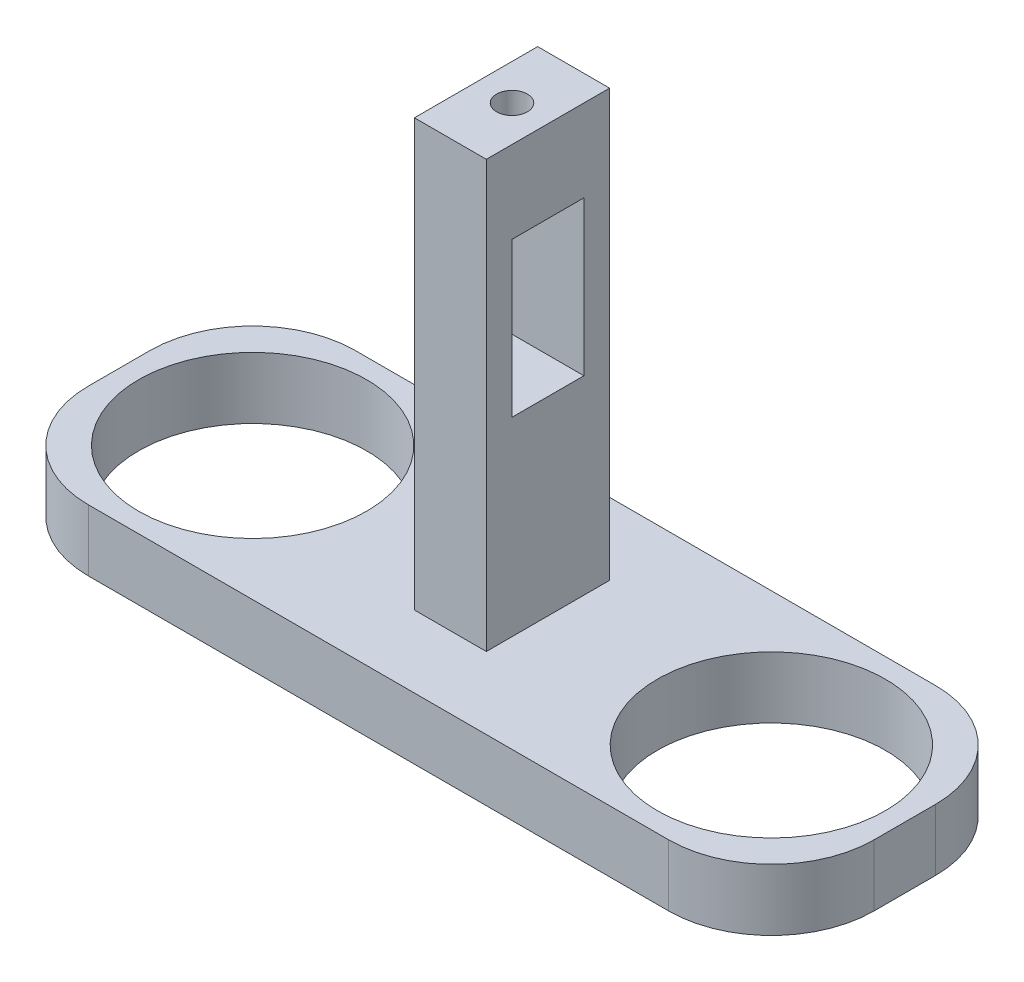
ISO-10303-21;
HEADER;
FILE_DESCRIPTION(('STEP AP214'),'2;1');
FILE_NAME('part.step','',(''),(''),'','','');
FILE_SCHEMA(('AUTOMOTIVE_DESIGN { 1 0 10303 214 1 1 1 1 }'));
ENDSEC;
DATA;
#1=APPLICATION_CONTEXT('core data for automotive mechanical design processes');
#2=APPLICATION_PROTOCOL_DEFINITION('international standard','automotive_design',2000,#1);
#3=PRODUCT_CONTEXT('',#1,'mechanical');
#4=PRODUCT('Part','Part','',(#3));
#5=PRODUCT_RELATED_PRODUCT_CATEGORY('part','',(#4));
#6=PRODUCT_DEFINITION_FORMATION('','',#4);
#7=PRODUCT_DEFINITION_CONTEXT('part definition',#1,'design');
#8=PRODUCT_DEFINITION('design','',#6,#7);
#9=PRODUCT_DEFINITION_SHAPE('','',#8);
#10=(LENGTH_UNIT() NAMED_UNIT(*) SI_UNIT(.MILLI.,.METRE.));
#11=(NAMED_UNIT(*) PLANE_ANGLE_UNIT() SI_UNIT($,.RADIAN.));
#12=(NAMED_UNIT(*) SI_UNIT($,.STERADIAN.) SOLID_ANGLE_UNIT());
#13=UNCERTAINTY_MEASURE_WITH_UNIT(LENGTH_MEASURE(1.E-05),#10,'distance_accuracy_value','');
#14=(GEOMETRIC_REPRESENTATION_CONTEXT(3) GLOBAL_UNCERTAINTY_ASSIGNED_CONTEXT((#13)) GLOBAL_UNIT_ASSIGNED_CONTEXT((#10,
#11,#12)) REPRESENTATION_CONTEXT('',''));
#15=CARTESIAN_POINT('',(0.,0.,0.));
#16=DIRECTION('',(0.,0.,1.));
#17=DIRECTION('',(1.,0.,0.));
#18=AXIS2_PLACEMENT_3D('',#15,#16,#17);
#19=CARTESIAN_POINT('',(-20.875,6.,13.));
#20=DIRECTION('',(1.,0.,0.));
#21=DIRECTION('',(0.,0.,-1.));
#22=AXIS2_PLACEMENT_3D('',#19,#20,#21);
#23=PLANE('',#22);
#24=DIRECTION('',(0.,0.,-1.));
#25=VECTOR('',#24,1.);
#26=CARTESIAN_POINT('',(-20.875,6.,13.));
#27=LINE('',#26,#25);
#28=CARTESIAN_POINT('',(-20.875,6.,6.));
#29=VERTEX_POINT('',#28);
#30=CARTESIAN_POINT('',(-20.875,6.,-6.));
#31=VERTEX_POINT('',#30);
#32=EDGE_CURVE('E204',#29,#31,#27,.T.);
#33=ORIENTED_EDGE('',*,*,#32,.F.);
#34=DIRECTION('',(0.,-1.,0.));
#35=VECTOR('',#34,1.);
#36=CARTESIAN_POINT('',(-20.875,47.5,6.));
#37=LINE('',#36,#35);
#38=CARTESIAN_POINT('',(-20.875,47.5,6.));
#39=VERTEX_POINT('',#38);
#40=EDGE_CURVE('E232',#39,#29,#37,.T.);
#41=ORIENTED_EDGE('',*,*,#40,.F.);
#42=DIRECTION('',(0.,0.,-1.));
#43=VECTOR('',#42,1.);
#44=CARTESIAN_POINT('',(-20.875,47.5,6.));
#45=LINE('',#44,#43);
#46=CARTESIAN_POINT('',(-20.875,47.5,-6.));
#47=VERTEX_POINT('',#46);
#48=EDGE_CURVE('E212',#39,#47,#45,.T.);
#49=ORIENTED_EDGE('',*,*,#48,.T.);
#50=DIRECTION('',(0.,-1.,0.));
#51=VECTOR('',#50,1.);
#52=CARTESIAN_POINT('',(-20.875,47.5,-6.));
#53=LINE('',#52,#51);
#54=EDGE_CURVE('E235',#47,#31,#53,.T.);
#55=ORIENTED_EDGE('',*,*,#54,.T.);
#56=EDGE_LOOP('',(#33,#41,#49,#55));
#57=FACE_BOUND('',#56,.T.);
#58=DIRECTION('',(0.,1.,0.));
#59=VECTOR('',#58,1.);
#60=CARTESIAN_POINT('',(-20.875,39.5,3.5));
#61=LINE('',#60,#59);
#62=CARTESIAN_POINT('',(-20.875,24.5,3.5));
#63=VERTEX_POINT('',#62);
#64=CARTESIAN_POINT('',(-20.875,39.5,3.5));
#65=VERTEX_POINT('',#64);
#66=EDGE_CURVE('E161',#63,#65,#61,.T.);
#67=ORIENTED_EDGE('',*,*,#66,.F.);
#68=DIRECTION('',(0.,0.,1.));
#69=VECTOR('',#68,1.);
#70=CARTESIAN_POINT('',(-20.875,24.5,-3.5));
#71=LINE('',#70,#69);
#72=CARTESIAN_POINT('',(-20.875,24.5,-3.5));
#73=VERTEX_POINT('',#72);
#74=EDGE_CURVE('E149',#73,#63,#71,.T.);
#75=ORIENTED_EDGE('',*,*,#74,.F.);
#76=DIRECTION('',(0.,-1.,0.));
#77=VECTOR('',#76,1.);
#78=CARTESIAN_POINT('',(-20.875,39.5,-3.5));
#79=LINE('',#78,#77);
#80=CARTESIAN_POINT('',(-20.875,39.5,-3.5));
#81=VERTEX_POINT('',#80);
#82=EDGE_CURVE('E160',#81,#73,#79,.T.);
#83=ORIENTED_EDGE('',*,*,#82,.F.);
#84=DIRECTION('',(0.,0.,-1.));
#85=VECTOR('',#84,1.);
#86=CARTESIAN_POINT('',(-20.875,39.5,-3.5));
#87=LINE('',#86,#85);
#88=EDGE_CURVE('E169',#65,#81,#87,.T.);
#89=ORIENTED_EDGE('',*,*,#88,.F.);
#90=EDGE_LOOP('',(#67,#75,#83,#89));
#91=FACE_BOUND('',#90,.T.);
#92=ADVANCED_FACE('F33',(#57,#91),#23,.F.);
#93=CARTESIAN_POINT('',(-13.875,47.5,6.));
#94=DIRECTION('',(-1.,0.,0.));
#95=DIRECTION('',(0.,0.,1.));
#96=AXIS2_PLACEMENT_3D('',#93,#94,#95);
#97=PLANE('',#96);
#98=DIRECTION('',(0.,0.,-1.));
#99=VECTOR('',#98,1.);
#100=CARTESIAN_POINT('',(-13.875,6.,6.));
#101=LINE('',#100,#99);
#102=CARTESIAN_POINT('',(-13.875,6.,6.));
#103=VERTEX_POINT('',#102);
#104=CARTESIAN_POINT('',(-13.875,6.,-6.));
#105=VERTEX_POINT('',#104);
#106=EDGE_CURVE('E213',#103,#105,#101,.T.);
#107=ORIENTED_EDGE('',*,*,#106,.T.);
#108=DIRECTION('',(0.,-1.,0.));
#109=VECTOR('',#108,1.);
#110=CARTESIAN_POINT('',(-13.875,47.5,-6.));
#111=LINE('',#110,#109);
#112=CARTESIAN_POINT('',(-13.875,47.5,-6.));
#113=VERTEX_POINT('',#112);
#114=EDGE_CURVE('E221',#113,#105,#111,.T.);
#115=ORIENTED_EDGE('',*,*,#114,.F.);
#116=DIRECTION('',(0.,0.,-1.));
#117=VECTOR('',#116,1.);
#118=CARTESIAN_POINT('',(-13.875,47.5,6.));
#119=LINE('',#118,#117);
#120=CARTESIAN_POINT('',(-13.875,47.5,6.));
#121=VERTEX_POINT('',#120);
#122=EDGE_CURVE('E219',#121,#113,#119,.T.);
#123=ORIENTED_EDGE('',*,*,#122,.F.);
#124=DIRECTION('',(0.,-1.,0.));
#125=VECTOR('',#124,1.);
#126=CARTESIAN_POINT('',(-13.875,47.5,6.));
#127=LINE('',#126,#125);
#128=EDGE_CURVE('E230',#121,#103,#127,.T.);
#129=ORIENTED_EDGE('',*,*,#128,.T.);
#130=EDGE_LOOP('',(#107,#115,#123,#129));
#131=FACE_BOUND('',#130,.T.);
#132=DIRECTION('',(0.,1.,0.));
#133=VECTOR('',#132,1.);
#134=CARTESIAN_POINT('',(-13.875,39.5,3.5));
#135=LINE('',#134,#133);
#136=CARTESIAN_POINT('',(-13.875,24.5,3.5));
#137=VERTEX_POINT('',#136);
#138=CARTESIAN_POINT('',(-13.875,39.5,3.5));
#139=VERTEX_POINT('',#138);
#140=EDGE_CURVE('E168',#137,#139,#135,.T.);
#141=ORIENTED_EDGE('',*,*,#140,.T.);
#142=DIRECTION('',(0.,0.,-1.));
#143=VECTOR('',#142,1.);
#144=CARTESIAN_POINT('',(-13.875,39.5,-3.5));
#145=LINE('',#144,#143);
#146=CARTESIAN_POINT('',(-13.875,39.5,-3.5));
#147=VERTEX_POINT('',#146);
#148=EDGE_CURVE('E172',#139,#147,#145,.T.);
#149=ORIENTED_EDGE('',*,*,#148,.T.);
#150=DIRECTION('',(0.,-1.,0.));
#151=VECTOR('',#150,1.);
#152=CARTESIAN_POINT('',(-13.875,39.5,-3.5));
#153=LINE('',#152,#151);
#154=CARTESIAN_POINT('',(-13.875,24.5,-3.5));
#155=VERTEX_POINT('',#154);
#156=EDGE_CURVE('E175',#147,#155,#153,.T.);
#157=ORIENTED_EDGE('',*,*,#156,.T.);
#158=DIRECTION('',(0.,0.,1.));
#159=VECTOR('',#158,1.);
#160=CARTESIAN_POINT('',(-13.875,24.5,-3.5));
#161=LINE('',#160,#159);
#162=EDGE_CURVE('E184',#155,#137,#161,.T.);
#163=ORIENTED_EDGE('',*,*,#162,.T.);
#164=EDGE_LOOP('',(#141,#149,#157,#163));
#165=FACE_BOUND('',#164,.T.);
#166=ADVANCED_FACE('F329',(#131,#165),#97,.F.);
#167=CARTESIAN_POINT('',(0.,6.,0.));
#168=DIRECTION('',(0.,-1.,0.));
#169=DIRECTION('',(0.,0.,-1.));
#170=AXIS2_PLACEMENT_3D('',#167,#168,#169);
#171=PLANE('',#170);
#172=CARTESIAN_POINT('',(-42.625,6.,0.));
#173=DIRECTION('',(0.,-1.,0.));
#174=DIRECTION('',(0.,0.,1.));
#175=AXIS2_PLACEMENT_3D('',#172,#173,#174);
#176=CIRCLE('',#175,11.1);
#177=CARTESIAN_POINT('',(-42.625,6.,11.1));
#178=VERTEX_POINT('',#177);
#179=EDGE_CURVE('E191',#178,#178,#176,.T.);
#180=ORIENTED_EDGE('',*,*,#179,.T.);
#181=EDGE_LOOP('',(#180));
#182=FACE_BOUND('',#181,.T.);
#183=DIRECTION('',(-1.,0.,0.));
#184=VECTOR('',#183,1.);
#185=CARTESIAN_POINT('',(-13.875,6.,-6.));
#186=LINE('',#185,#184);
#187=EDGE_CURVE('E209',#105,#31,#186,.T.);
#188=ORIENTED_EDGE('',*,*,#187,.F.);
#189=ORIENTED_EDGE('',*,*,#106,.F.);
#190=DIRECTION('',(-1.,0.,0.));
#191=VECTOR('',#190,1.);
#192=CARTESIAN_POINT('',(-13.875,6.,6.));
#193=LINE('',#192,#191);
#194=EDGE_CURVE('E224',#103,#29,#193,.T.);
#195=ORIENTED_EDGE('',*,*,#194,.T.);
#196=ORIENTED_EDGE('',*,*,#32,.T.);
#197=EDGE_LOOP('',(#188,#189,#195,#196));
#198=FACE_BOUND('',#197,.T.);
#199=CARTESIAN_POINT('',(7.875,6.,0.));
#200=DIRECTION('',(0.,1.,0.));
#201=DIRECTION('',(0.,0.,1.));
#202=AXIS2_PLACEMENT_3D('',#199,#200,#201);
#203=CIRCLE('',#202,11.1);
#204=CARTESIAN_POINT('',(7.875,6.,11.1));
#205=VERTEX_POINT('',#204);
#206=EDGE_CURVE('E237',#205,#205,#203,.T.);
#207=ORIENTED_EDGE('',*,*,#206,.F.);
#208=EDGE_LOOP('',(#207));
#209=FACE_BOUND('',#208,.T.);
#210=DIRECTION('',(-1.,0.,0.));
#211=VECTOR('',#210,1.);
#212=CARTESIAN_POINT('',(-20.875,6.,-13.));
#213=LINE('',#212,#211);
#214=CARTESIAN_POINT('',(10.875,6.,-13.));
#215=VERTEX_POINT('',#214);
#216=CARTESIAN_POINT('',(-45.625,6.,-13.));
#217=VERTEX_POINT('',#216);
#218=EDGE_CURVE('E247',#215,#217,#213,.T.);
#219=ORIENTED_EDGE('',*,*,#218,.T.);
#220=CARTESIAN_POINT('',(-45.625,6.,-3.));
#221=DIRECTION('',(0.,-1.,0.));
#222=DIRECTION('',(0.,0.,-1.));
#223=AXIS2_PLACEMENT_3D('',#220,#221,#222);
#224=CIRCLE('',#223,10.);
#225=CARTESIAN_POINT('',(-55.625,6.,-3.));
#226=VERTEX_POINT('',#225);
#227=EDGE_CURVE('E41',#217,#226,#224,.F.);
#228=ORIENTED_EDGE('',*,*,#227,.T.);
#229=DIRECTION('',(0.,0.,-1.));
#230=VECTOR('',#229,1.);
#231=CARTESIAN_POINT('',(-55.625,6.,13.));
#232=LINE('',#231,#230);
#233=CARTESIAN_POINT('',(-55.625,6.,3.));
#234=VERTEX_POINT('',#233);
#235=EDGE_CURVE('E201',#234,#226,#232,.T.);
#236=ORIENTED_EDGE('',*,*,#235,.F.);
#237=CARTESIAN_POINT('',(-45.625,6.,3.));
#238=DIRECTION('',(0.,-1.,0.));
#239=DIRECTION('',(0.,0.,-1.));
#240=AXIS2_PLACEMENT_3D('',#237,#238,#239);
#241=CIRCLE('',#240,10.);
#242=CARTESIAN_POINT('',(-45.625,6.,13.));
#243=VERTEX_POINT('',#242);
#244=EDGE_CURVE('E48',#234,#243,#241,.F.);
#245=ORIENTED_EDGE('',*,*,#244,.T.);
#246=DIRECTION('',(1.,0.,0.));
#247=VECTOR('',#246,1.);
#248=CARTESIAN_POINT('',(-20.875,6.,13.));
#249=LINE('',#248,#247);
#250=CARTESIAN_POINT('',(10.875,6.,13.));
#251=VERTEX_POINT('',#250);
#252=EDGE_CURVE('E250',#243,#251,#249,.T.);
#253=ORIENTED_EDGE('',*,*,#252,.T.);
#254=CARTESIAN_POINT('',(10.875,6.,3.));
#255=DIRECTION('',(0.,-1.,0.));
#256=DIRECTION('',(0.,0.,-1.));
#257=AXIS2_PLACEMENT_3D('',#254,#255,#256);
#258=CIRCLE('',#257,10.);
#259=CARTESIAN_POINT('',(20.875,6.,3.));
#260=VERTEX_POINT('',#259);
#261=EDGE_CURVE('E270',#251,#260,#258,.F.);
#262=ORIENTED_EDGE('',*,*,#261,.T.);
#263=DIRECTION('',(0.,0.,-1.));
#264=VECTOR('',#263,1.);
#265=CARTESIAN_POINT('',(20.875,6.,13.));
#266=LINE('',#265,#264);
#267=CARTESIAN_POINT('',(20.875,6.,-3.));
#268=VERTEX_POINT('',#267);
#269=EDGE_CURVE('E244',#260,#268,#266,.T.);
#270=ORIENTED_EDGE('',*,*,#269,.T.);
#271=CARTESIAN_POINT('',(10.875,6.,-3.));
#272=DIRECTION('',(0.,-1.,0.));
#273=DIRECTION('',(0.,0.,-1.));
#274=AXIS2_PLACEMENT_3D('',#271,#272,#273);
#275=CIRCLE('',#274,10.);
#276=EDGE_CURVE('E272',#268,#215,#275,.F.);
#277=ORIENTED_EDGE('',*,*,#276,.T.);
#278=EDGE_LOOP('',(#219,#228,#236,#245,#253,#262,#270,#277));
#279=FACE_BOUND('',#278,.T.);
#280=ADVANCED_FACE('F288',(#182,#198,#209,#279),#171,.F.);
#281=CARTESIAN_POINT('',(20.875,6.,13.));
#282=DIRECTION('',(-1.,0.,0.));
#283=DIRECTION('',(0.,0.,1.));
#284=AXIS2_PLACEMENT_3D('',#281,#282,#283);
#285=PLANE('',#284);
#286=DIRECTION('',(0.,0.,-1.));
#287=VECTOR('',#286,1.);
#288=CARTESIAN_POINT('',(20.875,0.,13.));
#289=LINE('',#288,#287);
#290=CARTESIAN_POINT('',(20.875,0.,3.));
#291=VERTEX_POINT('',#290);
#292=CARTESIAN_POINT('',(20.875,0.,-3.));
#293=VERTEX_POINT('',#292);
#294=EDGE_CURVE('E241',#291,#293,#289,.T.);
#295=ORIENTED_EDGE('',*,*,#294,.T.);
#296=DIRECTION('',(0.,-1.,0.));
#297=VECTOR('',#296,1.);
#298=CARTESIAN_POINT('',(20.875,6.,-3.));
#299=LINE('',#298,#297);
#300=EDGE_CURVE('E268',#293,#268,#299,.F.);
#301=ORIENTED_EDGE('',*,*,#300,.T.);
#302=ORIENTED_EDGE('',*,*,#269,.F.);
#303=DIRECTION('',(0.,-1.,0.));
#304=VECTOR('',#303,1.);
#305=CARTESIAN_POINT('',(20.875,6.,3.));
#306=LINE('',#305,#304);
#307=EDGE_CURVE('E265',#260,#291,#306,.T.);
#308=ORIENTED_EDGE('',*,*,#307,.T.);
#309=EDGE_LOOP('',(#295,#301,#302,#308));
#310=FACE_BOUND('',#309,.T.);
#311=ADVANCED_FACE('F308',(#310),#285,.F.);
#312=CARTESIAN_POINT('',(-20.875,6.,-13.));
#313=DIRECTION('',(0.,0.,1.));
#314=DIRECTION('',(1.,0.,0.));
#315=AXIS2_PLACEMENT_3D('',#312,#313,#314);
#316=PLANE('',#315);
#317=DIRECTION('',(-1.,0.,0.));
#318=VECTOR('',#317,1.);
#319=CARTESIAN_POINT('',(-20.875,0.,-13.));
#320=LINE('',#319,#318);
#321=CARTESIAN_POINT('',(10.875,0.,-13.));
#322=VERTEX_POINT('',#321);
#323=CARTESIAN_POINT('',(-45.625,0.,-13.));
#324=VERTEX_POINT('',#323);
#325=EDGE_CURVE('E255',#322,#324,#320,.T.);
#326=ORIENTED_EDGE('',*,*,#325,.T.);
#327=DIRECTION('',(0.,-1.,0.));
#328=VECTOR('',#327,1.);
#329=CARTESIAN_POINT('',(-45.625,6.,-13.));
#330=LINE('',#329,#328);
#331=EDGE_CURVE('E56',#324,#217,#330,.F.);
#332=ORIENTED_EDGE('',*,*,#331,.T.);
#333=ORIENTED_EDGE('',*,*,#218,.F.);
#334=DIRECTION('',(0.,-1.,0.));
#335=VECTOR('',#334,1.);
#336=CARTESIAN_POINT('',(10.875,6.,-13.));
#337=LINE('',#336,#335);
#338=EDGE_CURVE('E252',#215,#322,#337,.T.);
#339=ORIENTED_EDGE('',*,*,#338,.T.);
#340=EDGE_LOOP('',(#326,#332,#333,#339));
#341=FACE_BOUND('',#340,.T.);
#342=ADVANCED_FACE('F300',(#341),#316,.F.);
#343=CARTESIAN_POINT('',(-20.875,6.,13.));
#344=DIRECTION('',(0.,0.,-1.));
#345=DIRECTION('',(-1.,0.,0.));
#346=AXIS2_PLACEMENT_3D('',#343,#344,#345);
#347=PLANE('',#346);
#348=ORIENTED_EDGE('',*,*,#252,.F.);
#349=DIRECTION('',(0.,-1.,0.));
#350=VECTOR('',#349,1.);
#351=CARTESIAN_POINT('',(-45.625,0.,13.));
#352=LINE('',#351,#350);
#353=CARTESIAN_POINT('',(-45.625,0.,13.));
#354=VERTEX_POINT('',#353);
#355=EDGE_CURVE('E11',#243,#354,#352,.T.);
#356=ORIENTED_EDGE('',*,*,#355,.T.);
#357=DIRECTION('',(1.,0.,0.));
#358=VECTOR('',#357,1.);
#359=CARTESIAN_POINT('',(-20.875,0.,13.));
#360=LINE('',#359,#358);
#361=CARTESIAN_POINT('',(10.875,0.,13.));
#362=VERTEX_POINT('',#361);
#363=EDGE_CURVE('E248',#354,#362,#360,.T.);
#364=ORIENTED_EDGE('',*,*,#363,.T.);
#365=DIRECTION('',(0.,-1.,0.));
#366=VECTOR('',#365,1.);
#367=CARTESIAN_POINT('',(10.875,6.,13.));
#368=LINE('',#367,#366);
#369=EDGE_CURVE('E274',#362,#251,#368,.F.);
#370=ORIENTED_EDGE('',*,*,#369,.T.);
#371=EDGE_LOOP('',(#348,#356,#364,#370));
#372=FACE_BOUND('',#371,.T.);
#373=ADVANCED_FACE('F317',(#372),#347,.F.);
#374=CARTESIAN_POINT('',(0.,0.,0.));
#375=DIRECTION('',(0.,-1.,0.));
#376=DIRECTION('',(0.,0.,-1.));
#377=AXIS2_PLACEMENT_3D('',#374,#375,#376);
#378=PLANE('',#377);
#379=CARTESIAN_POINT('',(-42.625,0.,0.));
#380=DIRECTION('',(0.,-1.,0.));
#381=DIRECTION('',(0.,0.,1.));
#382=AXIS2_PLACEMENT_3D('',#379,#380,#381);
#383=CIRCLE('',#382,11.1);
#384=CARTESIAN_POINT('',(-42.625,0.,11.1));
#385=VERTEX_POINT('',#384);
#386=EDGE_CURVE('E195',#385,#385,#383,.T.);
#387=ORIENTED_EDGE('',*,*,#386,.F.);
#388=EDGE_LOOP('',(#387));
#389=FACE_BOUND('',#388,.T.);
#390=DIRECTION('',(0.,0.,-1.));
#391=VECTOR('',#390,1.);
#392=CARTESIAN_POINT('',(-55.625,0.,13.));
#393=LINE('',#392,#391);
#394=CARTESIAN_POINT('',(-55.625,0.,3.));
#395=VERTEX_POINT('',#394);
#396=CARTESIAN_POINT('',(-55.625,0.,-3.));
#397=VERTEX_POINT('',#396);
#398=EDGE_CURVE('E198',#395,#397,#393,.T.);
#399=ORIENTED_EDGE('',*,*,#398,.T.);
#400=CARTESIAN_POINT('',(-45.625,0.,-3.));
#401=DIRECTION('',(0.,-1.,0.));
#402=DIRECTION('',(0.,0.,-1.));
#403=AXIS2_PLACEMENT_3D('',#400,#401,#402);
#404=CIRCLE('',#403,10.);
#405=EDGE_CURVE('E284',#397,#324,#404,.T.);
#406=ORIENTED_EDGE('',*,*,#405,.T.);
#407=ORIENTED_EDGE('',*,*,#325,.F.);
#408=CARTESIAN_POINT('',(10.875,0.,-3.));
#409=DIRECTION('',(0.,-1.,0.));
#410=DIRECTION('',(0.,0.,-1.));
#411=AXIS2_PLACEMENT_3D('',#408,#409,#410);
#412=CIRCLE('',#411,10.);
#413=EDGE_CURVE('E263',#322,#293,#412,.T.);
#414=ORIENTED_EDGE('',*,*,#413,.T.);
#415=ORIENTED_EDGE('',*,*,#294,.F.);
#416=CARTESIAN_POINT('',(10.875,0.,3.));
#417=DIRECTION('',(0.,-1.,0.));
#418=DIRECTION('',(0.,0.,-1.));
#419=AXIS2_PLACEMENT_3D('',#416,#417,#418);
#420=CIRCLE('',#419,10.);
#421=EDGE_CURVE('E260',#291,#362,#420,.T.);
#422=ORIENTED_EDGE('',*,*,#421,.T.);
#423=ORIENTED_EDGE('',*,*,#363,.F.);
#424=CARTESIAN_POINT('',(-45.625,0.,3.));
#425=DIRECTION('',(0.,-1.,0.));
#426=DIRECTION('',(0.,0.,-1.));
#427=AXIS2_PLACEMENT_3D('',#424,#425,#426);
#428=CIRCLE('',#427,10.);
#429=EDGE_CURVE('E282',#354,#395,#428,.T.);
#430=ORIENTED_EDGE('',*,*,#429,.T.);
#431=EDGE_LOOP('',(#399,#406,#407,#414,#415,#422,#423,#430));
#432=FACE_BOUND('',#431,.T.);
#433=CARTESIAN_POINT('',(7.875,0.,0.));
#434=DIRECTION('',(0.,1.,0.));
#435=DIRECTION('',(0.,0.,1.));
#436=AXIS2_PLACEMENT_3D('',#433,#434,#435);
#437=CIRCLE('',#436,11.1);
#438=CARTESIAN_POINT('',(7.875,0.,11.1));
#439=VERTEX_POINT('',#438);
#440=EDGE_CURVE('E238',#439,#439,#437,.T.);
#441=ORIENTED_EDGE('',*,*,#440,.T.);
#442=EDGE_LOOP('',(#441));
#443=FACE_BOUND('',#442,.T.);
#444=ADVANCED_FACE('F298',(#389,#432,#443),#378,.T.);
#445=CARTESIAN_POINT('',(7.875,0.,0.));
#446=DIRECTION('',(0.,1.,0.));
#447=DIRECTION('',(0.,0.,1.));
#448=AXIS2_PLACEMENT_3D('',#445,#446,#447);
#449=CYLINDRICAL_SURFACE('',#448,11.1);
#450=ORIENTED_EDGE('',*,*,#440,.F.);
#451=EDGE_LOOP('',(#450));
#452=FACE_BOUND('',#451,.T.);
#453=ORIENTED_EDGE('',*,*,#206,.T.);
#454=EDGE_LOOP('',(#453));
#455=FACE_BOUND('',#454,.T.);
#456=ADVANCED_FACE('F370',(#452,#455),#449,.F.);
#457=CARTESIAN_POINT('',(-13.875,47.5,-6.));
#458=DIRECTION('',(0.,0.,1.));
#459=DIRECTION('',(1.,0.,0.));
#460=AXIS2_PLACEMENT_3D('',#457,#458,#459);
#461=PLANE('',#460);
#462=ORIENTED_EDGE('',*,*,#187,.T.);
#463=ORIENTED_EDGE('',*,*,#54,.F.);
#464=DIRECTION('',(-1.,0.,0.));
#465=VECTOR('',#464,1.);
#466=CARTESIAN_POINT('',(-13.875,47.5,-6.));
#467=LINE('',#466,#465);
#468=EDGE_CURVE('E210',#113,#47,#467,.T.);
#469=ORIENTED_EDGE('',*,*,#468,.F.);
#470=ORIENTED_EDGE('',*,*,#114,.T.);
#471=EDGE_LOOP('',(#462,#463,#469,#470));
#472=FACE_BOUND('',#471,.T.);
#473=ADVANCED_FACE('F366',(#472),#461,.F.);
#474=CARTESIAN_POINT('',(-13.875,47.5,6.));
#475=DIRECTION('',(0.,0.,1.));
#476=DIRECTION('',(1.,0.,0.));
#477=AXIS2_PLACEMENT_3D('',#474,#475,#476);
#478=PLANE('',#477);
#479=ORIENTED_EDGE('',*,*,#194,.F.);
#480=ORIENTED_EDGE('',*,*,#128,.F.);
#481=DIRECTION('',(-1.,0.,0.));
#482=VECTOR('',#481,1.);
#483=CARTESIAN_POINT('',(-13.875,47.5,6.));
#484=LINE('',#483,#482);
#485=EDGE_CURVE('E216',#121,#39,#484,.T.);
#486=ORIENTED_EDGE('',*,*,#485,.T.);
#487=ORIENTED_EDGE('',*,*,#40,.T.);
#488=EDGE_LOOP('',(#479,#480,#486,#487));
#489=FACE_BOUND('',#488,.T.);
#490=ADVANCED_FACE('F361',(#489),#478,.T.);
#491=CARTESIAN_POINT('',(0.,47.5,0.));
#492=DIRECTION('',(0.,-1.,0.));
#493=DIRECTION('',(0.,0.,-1.));
#494=AXIS2_PLACEMENT_3D('',#491,#492,#493);
#495=PLANE('',#494);
#496=CARTESIAN_POINT('',(-17.375,47.5,0.));
#497=DIRECTION('',(0.,1.,0.));
#498=DIRECTION('',(0.,0.,1.));
#499=AXIS2_PLACEMENT_3D('',#496,#497,#498);
#500=CIRCLE('',#499,1.5);
#501=CARTESIAN_POINT('',(-17.375,47.5,1.5));
#502=VERTEX_POINT('',#501);
#503=EDGE_CURVE('E178',#502,#502,#500,.T.);
#504=ORIENTED_EDGE('',*,*,#503,.F.);
#505=EDGE_LOOP('',(#504));
#506=FACE_BOUND('',#505,.T.);
#507=ORIENTED_EDGE('',*,*,#468,.T.);
#508=ORIENTED_EDGE('',*,*,#48,.F.);
#509=ORIENTED_EDGE('',*,*,#485,.F.);
#510=ORIENTED_EDGE('',*,*,#122,.T.);
#511=EDGE_LOOP('',(#507,#508,#509,#510));
#512=FACE_BOUND('',#511,.T.);
#513=ADVANCED_FACE('F346',(#506,#512),#495,.F.);
#514=CARTESIAN_POINT('',(10.875,6.,-3.));
#515=DIRECTION('',(0.,-1.,0.));
#516=DIRECTION('',(0.,0.,-1.));
#517=AXIS2_PLACEMENT_3D('',#514,#515,#516);
#518=CYLINDRICAL_SURFACE('',#517,10.);
#519=ORIENTED_EDGE('',*,*,#276,.F.);
#520=ORIENTED_EDGE('',*,*,#300,.F.);
#521=ORIENTED_EDGE('',*,*,#413,.F.);
#522=ORIENTED_EDGE('',*,*,#338,.F.);
#523=EDGE_LOOP('',(#519,#520,#521,#522));
#524=FACE_BOUND('',#523,.T.);
#525=ADVANCED_FACE('F304',(#524),#518,.T.);
#526=CARTESIAN_POINT('',(10.875,6.,3.));
#527=DIRECTION('',(0.,-1.,0.));
#528=DIRECTION('',(0.,0.,-1.));
#529=AXIS2_PLACEMENT_3D('',#526,#527,#528);
#530=CYLINDRICAL_SURFACE('',#529,10.);
#531=ORIENTED_EDGE('',*,*,#261,.F.);
#532=ORIENTED_EDGE('',*,*,#369,.F.);
#533=ORIENTED_EDGE('',*,*,#421,.F.);
#534=ORIENTED_EDGE('',*,*,#307,.F.);
#535=EDGE_LOOP('',(#531,#532,#533,#534));
#536=FACE_BOUND('',#535,.T.);
#537=ADVANCED_FACE('F313',(#536),#530,.T.);
#538=CARTESIAN_POINT('',(-55.625,6.,13.));
#539=DIRECTION('',(-1.,0.,0.));
#540=DIRECTION('',(0.,0.,1.));
#541=AXIS2_PLACEMENT_3D('',#538,#539,#540);
#542=PLANE('',#541);
#543=ORIENTED_EDGE('',*,*,#235,.T.);
#544=DIRECTION('',(0.,-1.,0.));
#545=VECTOR('',#544,1.);
#546=CARTESIAN_POINT('',(-55.625,0.,-3.));
#547=LINE('',#546,#545);
#548=EDGE_CURVE('E279',#226,#397,#547,.T.);
#549=ORIENTED_EDGE('',*,*,#548,.T.);
#550=ORIENTED_EDGE('',*,*,#398,.F.);
#551=DIRECTION('',(0.,-1.,0.));
#552=VECTOR('',#551,1.);
#553=CARTESIAN_POINT('',(-55.625,6.,3.));
#554=LINE('',#553,#552);
#555=EDGE_CURVE('E277',#395,#234,#554,.F.);
#556=ORIENTED_EDGE('',*,*,#555,.T.);
#557=EDGE_LOOP('',(#543,#549,#550,#556));
#558=FACE_BOUND('',#557,.T.);
#559=ADVANCED_FACE('F292',(#558),#542,.T.);
#560=CARTESIAN_POINT('',(-42.625,0.,0.));
#561=DIRECTION('',(0.,1.,0.));
#562=DIRECTION('',(0.,0.,1.));
#563=AXIS2_PLACEMENT_3D('',#560,#561,#562);
#564=CYLINDRICAL_SURFACE('',#563,11.1);
#565=ORIENTED_EDGE('',*,*,#386,.T.);
#566=EDGE_LOOP('',(#565));
#567=FACE_BOUND('',#566,.T.);
#568=ORIENTED_EDGE('',*,*,#179,.F.);
#569=EDGE_LOOP('',(#568));
#570=FACE_BOUND('',#569,.T.);
#571=ADVANCED_FACE('F351',(#567,#570),#564,.F.);
#572=CARTESIAN_POINT('',(-20.875,39.5,3.5));
#573=DIRECTION('',(0.,0.,-1.));
#574=DIRECTION('',(0.,1.,0.));
#575=AXIS2_PLACEMENT_3D('',#572,#573,#574);
#576=PLANE('',#575);
#577=ORIENTED_EDGE('',*,*,#140,.F.);
#578=DIRECTION('',(1.,0.,0.));
#579=VECTOR('',#578,1.);
#580=CARTESIAN_POINT('',(-20.875,24.5,3.5));
#581=LINE('',#580,#579);
#582=EDGE_CURVE('E153',#63,#137,#581,.T.);
#583=ORIENTED_EDGE('',*,*,#582,.F.);
#584=ORIENTED_EDGE('',*,*,#66,.T.);
#585=DIRECTION('',(1.,0.,0.));
#586=VECTOR('',#585,1.);
#587=CARTESIAN_POINT('',(-20.875,39.5,3.5));
#588=LINE('',#587,#586);
#589=EDGE_CURVE('E189',#65,#139,#588,.T.);
#590=ORIENTED_EDGE('',*,*,#589,.T.);
#591=EDGE_LOOP('',(#577,#583,#584,#590));
#592=FACE_BOUND('',#591,.T.);
#593=ADVANCED_FACE('F164',(#592),#576,.T.);
#594=CARTESIAN_POINT('',(-20.875,39.5,-3.5));
#595=DIRECTION('',(0.,-1.,0.));
#596=DIRECTION('',(0.,0.,-1.));
#597=AXIS2_PLACEMENT_3D('',#594,#595,#596);
#598=PLANE('',#597);
#599=CARTESIAN_POINT('',(-17.375,39.5,0.));
#600=DIRECTION('',(0.,1.,0.));
#601=DIRECTION('',(0.,0.,1.));
#602=AXIS2_PLACEMENT_3D('',#599,#600,#601);
#603=CIRCLE('',#602,1.5);
#604=CARTESIAN_POINT('',(-17.375,39.5,1.5));
#605=VERTEX_POINT('',#604);
#606=EDGE_CURVE('E185',#605,#605,#603,.T.);
#607=ORIENTED_EDGE('',*,*,#606,.T.);
#608=EDGE_LOOP('',(#607));
#609=FACE_BOUND('',#608,.T.);
#610=ORIENTED_EDGE('',*,*,#148,.F.);
#611=ORIENTED_EDGE('',*,*,#589,.F.);
#612=ORIENTED_EDGE('',*,*,#88,.T.);
#613=DIRECTION('',(1.,0.,0.));
#614=VECTOR('',#613,1.);
#615=CARTESIAN_POINT('',(-20.875,39.5,-3.5));
#616=LINE('',#615,#614);
#617=EDGE_CURVE('E192',#81,#147,#616,.T.);
#618=ORIENTED_EDGE('',*,*,#617,.T.);
#619=EDGE_LOOP('',(#610,#611,#612,#618));
#620=FACE_BOUND('',#619,.T.);
#621=ADVANCED_FACE('F405',(#609,#620),#598,.T.);
#622=CARTESIAN_POINT('',(-20.875,39.5,-3.5));
#623=DIRECTION('',(0.,0.,1.));
#624=DIRECTION('',(0.,-1.,0.));
#625=AXIS2_PLACEMENT_3D('',#622,#623,#624);
#626=PLANE('',#625);
#627=ORIENTED_EDGE('',*,*,#156,.F.);
#628=ORIENTED_EDGE('',*,*,#617,.F.);
#629=ORIENTED_EDGE('',*,*,#82,.T.);
#630=DIRECTION('',(1.,0.,0.));
#631=VECTOR('',#630,1.);
#632=CARTESIAN_POINT('',(-20.875,24.5,-3.5));
#633=LINE('',#632,#631);
#634=EDGE_CURVE('E155',#73,#155,#633,.T.);
#635=ORIENTED_EDGE('',*,*,#634,.T.);
#636=EDGE_LOOP('',(#627,#628,#629,#635));
#637=FACE_BOUND('',#636,.T.);
#638=ADVANCED_FACE('F403',(#637),#626,.T.);
#639=CARTESIAN_POINT('',(-20.875,24.5,-3.5));
#640=DIRECTION('',(0.,1.,0.));
#641=DIRECTION('',(0.,0.,1.));
#642=AXIS2_PLACEMENT_3D('',#639,#640,#641);
#643=PLANE('',#642);
#644=ORIENTED_EDGE('',*,*,#162,.F.);
#645=ORIENTED_EDGE('',*,*,#634,.F.);
#646=ORIENTED_EDGE('',*,*,#74,.T.);
#647=ORIENTED_EDGE('',*,*,#582,.T.);
#648=EDGE_LOOP('',(#644,#645,#646,#647));
#649=FACE_BOUND('',#648,.T.);
#650=ADVANCED_FACE('F152',(#649),#643,.T.);
#651=CARTESIAN_POINT('',(-45.625,6.,-3.));
#652=DIRECTION('',(0.,1.,0.));
#653=DIRECTION('',(0.,0.,1.));
#654=AXIS2_PLACEMENT_3D('',#651,#652,#653);
#655=CYLINDRICAL_SURFACE('',#654,10.);
#656=ORIENTED_EDGE('',*,*,#227,.F.);
#657=ORIENTED_EDGE('',*,*,#331,.F.);
#658=ORIENTED_EDGE('',*,*,#405,.F.);
#659=ORIENTED_EDGE('',*,*,#548,.F.);
#660=EDGE_LOOP('',(#656,#657,#658,#659));
#661=FACE_BOUND('',#660,.T.);
#662=ADVANCED_FACE('F295',(#661),#655,.T.);
#663=CARTESIAN_POINT('',(-45.625,6.,3.));
#664=DIRECTION('',(0.,1.,0.));
#665=DIRECTION('',(0.,0.,1.));
#666=AXIS2_PLACEMENT_3D('',#663,#664,#665);
#667=CYLINDRICAL_SURFACE('',#666,10.);
#668=ORIENTED_EDGE('',*,*,#244,.F.);
#669=ORIENTED_EDGE('',*,*,#555,.F.);
#670=ORIENTED_EDGE('',*,*,#429,.F.);
#671=ORIENTED_EDGE('',*,*,#355,.F.);
#672=EDGE_LOOP('',(#668,#669,#670,#671));
#673=FACE_BOUND('',#672,.T.);
#674=ADVANCED_FACE('F35',(#673),#667,.T.);
#675=CARTESIAN_POINT('',(-17.375,39.5,0.));
#676=DIRECTION('',(0.,1.,0.));
#677=DIRECTION('',(0.,0.,1.));
#678=AXIS2_PLACEMENT_3D('',#675,#676,#677);
#679=CYLINDRICAL_SURFACE('',#678,1.5);
#680=ORIENTED_EDGE('',*,*,#606,.F.);
#681=EDGE_LOOP('',(#680));
#682=FACE_BOUND('',#681,.T.);
#683=ORIENTED_EDGE('',*,*,#503,.T.);
#684=EDGE_LOOP('',(#683));
#685=FACE_BOUND('',#684,.T.);
#686=ADVANCED_FACE('F321',(#682,#685),#679,.F.);
#687=CLOSED_SHELL('',(#92,#166,#280,#311,#342,#373,#444,#456,#473,#490,#513,#525,#537,#559,#571,
#593,#621,#638,#650,#662,#674,#686));
#688=MANIFOLD_SOLID_BREP('B2',#687);
#689=ADVANCED_BREP_SHAPE_REPRESENTATION('',(#18,#688),#14);
#690=SHAPE_DEFINITION_REPRESENTATION(#9,#689);
ENDSEC;
END-ISO-10303-21;
